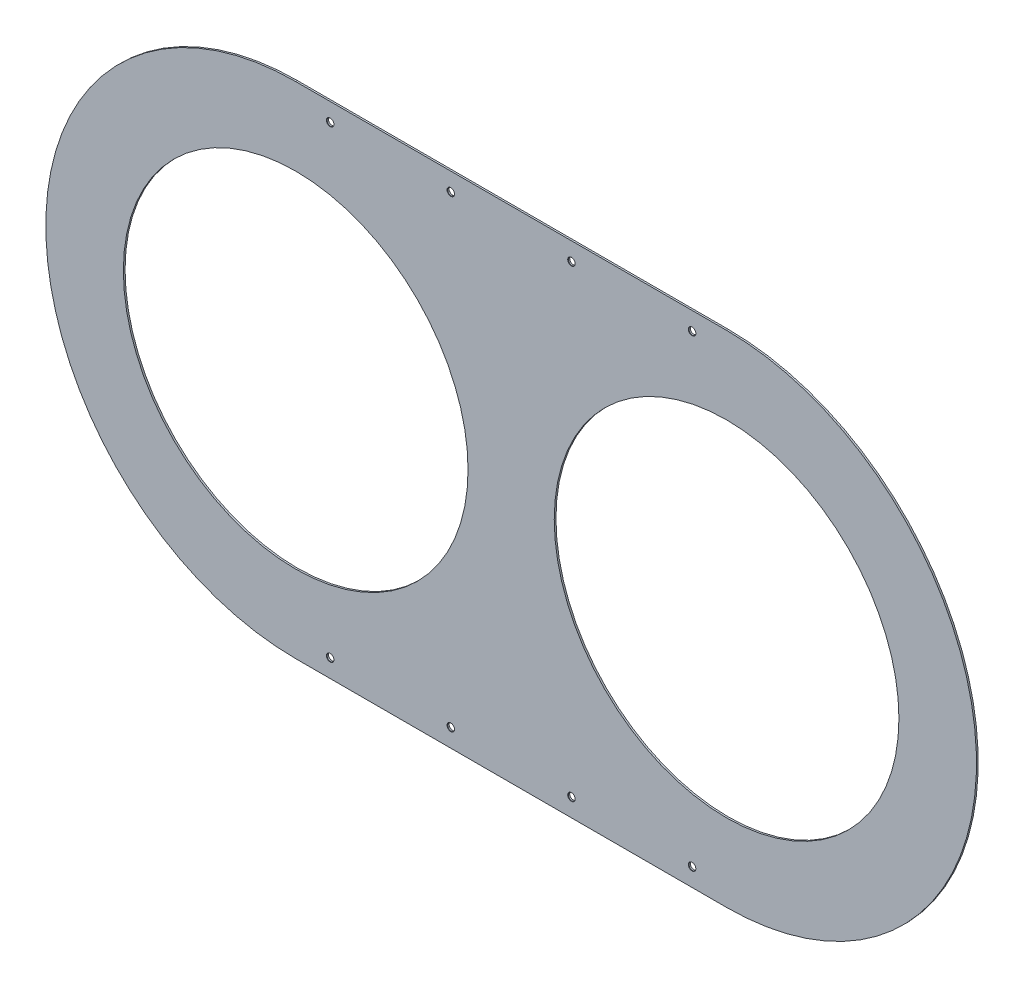
ISO-10303-21;
HEADER;
FILE_DESCRIPTION(('STEP AP214'),'2;1');
FILE_NAME('part.step','',(''),(''),'','','');
FILE_SCHEMA(('AUTOMOTIVE_DESIGN { 1 0 10303 214 1 1 1 1 }'));
ENDSEC;
DATA;
#1=APPLICATION_CONTEXT('core data for automotive mechanical design processes');
#2=APPLICATION_PROTOCOL_DEFINITION('international standard','automotive_design',2000,#1);
#3=PRODUCT_CONTEXT('',#1,'mechanical');
#4=PRODUCT('Part','Part','',(#3));
#5=PRODUCT_RELATED_PRODUCT_CATEGORY('part','',(#4));
#6=PRODUCT_DEFINITION_FORMATION('','',#4);
#7=PRODUCT_DEFINITION_CONTEXT('part definition',#1,'design');
#8=PRODUCT_DEFINITION('design','',#6,#7);
#9=PRODUCT_DEFINITION_SHAPE('','',#8);
#10=(LENGTH_UNIT() NAMED_UNIT(*) SI_UNIT(.MILLI.,.METRE.));
#11=(NAMED_UNIT(*) PLANE_ANGLE_UNIT() SI_UNIT($,.RADIAN.));
#12=(NAMED_UNIT(*) SI_UNIT($,.STERADIAN.) SOLID_ANGLE_UNIT());
#13=UNCERTAINTY_MEASURE_WITH_UNIT(LENGTH_MEASURE(1.E-05),#10,'distance_accuracy_value','');
#14=(GEOMETRIC_REPRESENTATION_CONTEXT(3) GLOBAL_UNCERTAINTY_ASSIGNED_CONTEXT((#13)) GLOBAL_UNIT_ASSIGNED_CONTEXT((#10,
#11,#12)) REPRESENTATION_CONTEXT('',''));
#15=CARTESIAN_POINT('',(0.,0.,0.));
#16=DIRECTION('',(0.,0.,1.));
#17=DIRECTION('',(1.,0.,0.));
#18=AXIS2_PLACEMENT_3D('',#15,#16,#17);
#19=CARTESIAN_POINT('',(-125.,0.,-1.));
#20=DIRECTION('',(0.,0.,1.));
#21=DIRECTION('',(1.,0.,0.));
#22=AXIS2_PLACEMENT_3D('',#19,#20,#21);
#23=CYLINDRICAL_SURFACE('',#22,145.);
#24=CARTESIAN_POINT('',(-125.,0.,0.));
#25=DIRECTION('',(0.,0.,1.));
#26=DIRECTION('',(1.,0.,0.));
#27=AXIS2_PLACEMENT_3D('',#24,#25,#26);
#28=CIRCLE('',#27,145.);
#29=CARTESIAN_POINT('',(-125.,145.,0.));
#30=VERTEX_POINT('',#29);
#31=CARTESIAN_POINT('',(-125.,-145.,0.));
#32=VERTEX_POINT('',#31);
#33=EDGE_CURVE('E103',#30,#32,#28,.T.);
#34=ORIENTED_EDGE('',*,*,#33,.F.);
#35=DIRECTION('',(0.,0.,1.));
#36=VECTOR('',#35,1.);
#37=CARTESIAN_POINT('',(-125.,145.,-1.));
#38=LINE('',#37,#36);
#39=CARTESIAN_POINT('',(-125.,145.,-1.));
#40=VERTEX_POINT('',#39);
#41=EDGE_CURVE('E11',#40,#30,#38,.T.);
#42=ORIENTED_EDGE('',*,*,#41,.F.);
#43=CARTESIAN_POINT('',(-125.,0.,-1.));
#44=DIRECTION('',(0.,0.,1.));
#45=DIRECTION('',(1.,0.,0.));
#46=AXIS2_PLACEMENT_3D('',#43,#44,#45);
#47=CIRCLE('',#46,145.);
#48=CARTESIAN_POINT('',(-125.,-145.,-1.));
#49=VERTEX_POINT('',#48);
#50=EDGE_CURVE('E96',#40,#49,#47,.T.);
#51=ORIENTED_EDGE('',*,*,#50,.T.);
#52=DIRECTION('',(0.,0.,1.));
#53=VECTOR('',#52,1.);
#54=CARTESIAN_POINT('',(-125.,-145.,-1.));
#55=LINE('',#54,#53);
#56=EDGE_CURVE('E79',#49,#32,#55,.T.);
#57=ORIENTED_EDGE('',*,*,#56,.T.);
#58=EDGE_LOOP('',(#34,#42,#51,#57));
#59=FACE_BOUND('',#58,.T.);
#60=ADVANCED_FACE('F36',(#59),#23,.T.);
#61=CARTESIAN_POINT('',(-125.,145.,-1.));
#62=DIRECTION('',(0.,1.,0.));
#63=DIRECTION('',(0.,0.,1.));
#64=AXIS2_PLACEMENT_3D('',#61,#62,#63);
#65=PLANE('',#64);
#66=DIRECTION('',(-1.,0.,0.));
#67=VECTOR('',#66,1.);
#68=CARTESIAN_POINT('',(-125.,145.,0.));
#69=LINE('',#68,#67);
#70=CARTESIAN_POINT('',(125.,145.,0.));
#71=VERTEX_POINT('',#70);
#72=EDGE_CURVE('E98',#71,#30,#69,.T.);
#73=ORIENTED_EDGE('',*,*,#72,.F.);
#74=DIRECTION('',(0.,0.,1.));
#75=VECTOR('',#74,1.);
#76=CARTESIAN_POINT('',(125.,145.,-1.));
#77=LINE('',#76,#75);
#78=CARTESIAN_POINT('',(125.,145.,-1.));
#79=VERTEX_POINT('',#78);
#80=EDGE_CURVE('E45',#79,#71,#77,.T.);
#81=ORIENTED_EDGE('',*,*,#80,.F.);
#82=DIRECTION('',(-1.,0.,0.));
#83=VECTOR('',#82,1.);
#84=CARTESIAN_POINT('',(-125.,145.,-1.));
#85=LINE('',#84,#83);
#86=EDGE_CURVE('E93',#79,#40,#85,.T.);
#87=ORIENTED_EDGE('',*,*,#86,.T.);
#88=ORIENTED_EDGE('',*,*,#41,.T.);
#89=EDGE_LOOP('',(#73,#81,#87,#88));
#90=FACE_BOUND('',#89,.T.);
#91=ADVANCED_FACE('F199',(#90),#65,.T.);
#92=CARTESIAN_POINT('',(125.,0.,-1.));
#93=DIRECTION('',(0.,0.,1.));
#94=DIRECTION('',(1.,0.,0.));
#95=AXIS2_PLACEMENT_3D('',#92,#93,#94);
#96=CYLINDRICAL_SURFACE('',#95,145.);
#97=CARTESIAN_POINT('',(125.,0.,0.));
#98=DIRECTION('',(0.,0.,1.));
#99=DIRECTION('',(1.,0.,0.));
#100=AXIS2_PLACEMENT_3D('',#97,#98,#99);
#101=CIRCLE('',#100,145.);
#102=CARTESIAN_POINT('',(125.,-145.,0.));
#103=VERTEX_POINT('',#102);
#104=EDGE_CURVE('E87',#103,#71,#101,.T.);
#105=ORIENTED_EDGE('',*,*,#104,.F.);
#106=DIRECTION('',(0.,0.,1.));
#107=VECTOR('',#106,1.);
#108=CARTESIAN_POINT('',(125.,-145.,-1.));
#109=LINE('',#108,#107);
#110=CARTESIAN_POINT('',(125.,-145.,-1.));
#111=VERTEX_POINT('',#110);
#112=EDGE_CURVE('E82',#111,#103,#109,.T.);
#113=ORIENTED_EDGE('',*,*,#112,.F.);
#114=CARTESIAN_POINT('',(125.,0.,-1.));
#115=DIRECTION('',(0.,0.,1.));
#116=DIRECTION('',(1.,0.,0.));
#117=AXIS2_PLACEMENT_3D('',#114,#115,#116);
#118=CIRCLE('',#117,145.);
#119=EDGE_CURVE('E85',#111,#79,#118,.T.);
#120=ORIENTED_EDGE('',*,*,#119,.T.);
#121=ORIENTED_EDGE('',*,*,#80,.T.);
#122=EDGE_LOOP('',(#105,#113,#120,#121));
#123=FACE_BOUND('',#122,.T.);
#124=ADVANCED_FACE('F84',(#123),#96,.T.);
#125=CARTESIAN_POINT('',(-125.,-145.,-1.));
#126=DIRECTION('',(0.,-1.,0.));
#127=DIRECTION('',(0.,0.,-1.));
#128=AXIS2_PLACEMENT_3D('',#125,#126,#127);
#129=PLANE('',#128);
#130=DIRECTION('',(1.,0.,0.));
#131=VECTOR('',#130,1.);
#132=CARTESIAN_POINT('',(-125.,-145.,0.));
#133=LINE('',#132,#131);
#134=EDGE_CURVE('E106',#32,#103,#133,.T.);
#135=ORIENTED_EDGE('',*,*,#134,.F.);
#136=ORIENTED_EDGE('',*,*,#56,.F.);
#137=DIRECTION('',(1.,0.,0.));
#138=VECTOR('',#137,1.);
#139=CARTESIAN_POINT('',(-125.,-145.,-1.));
#140=LINE('',#139,#138);
#141=EDGE_CURVE('E92',#49,#111,#140,.T.);
#142=ORIENTED_EDGE('',*,*,#141,.T.);
#143=ORIENTED_EDGE('',*,*,#112,.T.);
#144=EDGE_LOOP('',(#135,#136,#142,#143));
#145=FACE_BOUND('',#144,.T.);
#146=ADVANCED_FACE('F95',(#145),#129,.T.);
#147=CARTESIAN_POINT('',(-125.,0.,-1.));
#148=DIRECTION('',(0.,0.,1.));
#149=DIRECTION('',(1.,0.,0.));
#150=AXIS2_PLACEMENT_3D('',#147,#148,#149);
#151=PLANE('',#150);
#152=CARTESIAN_POINT('',(-105.,134.5,-1.));
#153=DIRECTION('',(0.,0.,1.));
#154=DIRECTION('',(1.,0.,0.));
#155=AXIS2_PLACEMENT_3D('',#152,#153,#154);
#156=CIRCLE('',#155,2.);
#157=CARTESIAN_POINT('',(-103.,134.5,-1.));
#158=VERTEX_POINT('',#157);
#159=EDGE_CURVE('E39',#158,#158,#156,.T.);
#160=ORIENTED_EDGE('',*,*,#159,.T.);
#161=EDGE_LOOP('',(#160));
#162=FACE_BOUND('',#161,.T.);
#163=CARTESIAN_POINT('',(35.,134.5,-1.));
#164=DIRECTION('',(0.,0.,1.));
#165=DIRECTION('',(1.,0.,0.));
#166=AXIS2_PLACEMENT_3D('',#163,#164,#165);
#167=CIRCLE('',#166,2.);
#168=CARTESIAN_POINT('',(37.,134.5,-1.));
#169=VERTEX_POINT('',#168);
#170=EDGE_CURVE('E143',#169,#169,#167,.T.);
#171=ORIENTED_EDGE('',*,*,#170,.T.);
#172=EDGE_LOOP('',(#171));
#173=FACE_BOUND('',#172,.T.);
#174=CARTESIAN_POINT('',(-35.,134.5,-1.));
#175=DIRECTION('',(0.,0.,1.));
#176=DIRECTION('',(1.,0.,0.));
#177=AXIS2_PLACEMENT_3D('',#174,#175,#176);
#178=CIRCLE('',#177,2.);
#179=CARTESIAN_POINT('',(-33.,134.5,-1.));
#180=VERTEX_POINT('',#179);
#181=EDGE_CURVE('E139',#180,#180,#178,.T.);
#182=ORIENTED_EDGE('',*,*,#181,.T.);
#183=EDGE_LOOP('',(#182));
#184=FACE_BOUND('',#183,.T.);
#185=CARTESIAN_POINT('',(105.,134.5,-1.));
#186=DIRECTION('',(0.,0.,1.));
#187=DIRECTION('',(1.,0.,0.));
#188=AXIS2_PLACEMENT_3D('',#185,#186,#187);
#189=CIRCLE('',#188,2.);
#190=CARTESIAN_POINT('',(107.,134.5,-1.));
#191=VERTEX_POINT('',#190);
#192=EDGE_CURVE('E134',#191,#191,#189,.T.);
#193=ORIENTED_EDGE('',*,*,#192,.T.);
#194=EDGE_LOOP('',(#193));
#195=FACE_BOUND('',#194,.T.);
#196=CARTESIAN_POINT('',(105.,-134.5,-1.));
#197=DIRECTION('',(0.,0.,1.));
#198=DIRECTION('',(1.,0.,0.));
#199=AXIS2_PLACEMENT_3D('',#196,#197,#198);
#200=CIRCLE('',#199,2.);
#201=CARTESIAN_POINT('',(107.,-134.5,-1.));
#202=VERTEX_POINT('',#201);
#203=EDGE_CURVE('E129',#202,#202,#200,.T.);
#204=ORIENTED_EDGE('',*,*,#203,.T.);
#205=EDGE_LOOP('',(#204));
#206=FACE_BOUND('',#205,.T.);
#207=CARTESIAN_POINT('',(35.,-134.5,-1.));
#208=DIRECTION('',(0.,0.,1.));
#209=DIRECTION('',(1.,0.,0.));
#210=AXIS2_PLACEMENT_3D('',#207,#208,#209);
#211=CIRCLE('',#210,2.);
#212=CARTESIAN_POINT('',(37.,-134.5,-1.));
#213=VERTEX_POINT('',#212);
#214=EDGE_CURVE('E124',#213,#213,#211,.T.);
#215=ORIENTED_EDGE('',*,*,#214,.T.);
#216=EDGE_LOOP('',(#215));
#217=FACE_BOUND('',#216,.T.);
#218=CARTESIAN_POINT('',(-35.,-134.5,-1.));
#219=DIRECTION('',(0.,0.,1.));
#220=DIRECTION('',(1.,0.,0.));
#221=AXIS2_PLACEMENT_3D('',#218,#219,#220);
#222=CIRCLE('',#221,2.);
#223=CARTESIAN_POINT('',(-33.,-134.5,-1.));
#224=VERTEX_POINT('',#223);
#225=EDGE_CURVE('E119',#224,#224,#222,.T.);
#226=ORIENTED_EDGE('',*,*,#225,.T.);
#227=EDGE_LOOP('',(#226));
#228=FACE_BOUND('',#227,.T.);
#229=CARTESIAN_POINT('',(-105.,-134.5,-1.));
#230=DIRECTION('',(0.,0.,1.));
#231=DIRECTION('',(1.,0.,0.));
#232=AXIS2_PLACEMENT_3D('',#229,#230,#231);
#233=CIRCLE('',#232,2.);
#234=CARTESIAN_POINT('',(-103.,-134.5,-1.));
#235=VERTEX_POINT('',#234);
#236=EDGE_CURVE('E114',#235,#235,#233,.T.);
#237=ORIENTED_EDGE('',*,*,#236,.T.);
#238=EDGE_LOOP('',(#237));
#239=FACE_BOUND('',#238,.T.);
#240=CARTESIAN_POINT('',(125.,0.,-1.));
#241=DIRECTION('',(0.,0.,1.));
#242=DIRECTION('',(1.,0.,0.));
#243=AXIS2_PLACEMENT_3D('',#240,#241,#242);
#244=CIRCLE('',#243,100.);
#245=CARTESIAN_POINT('',(225.,0.,-1.));
#246=VERTEX_POINT('',#245);
#247=EDGE_CURVE('E182',#246,#246,#244,.T.);
#248=ORIENTED_EDGE('',*,*,#247,.T.);
#249=EDGE_LOOP('',(#248));
#250=FACE_BOUND('',#249,.T.);
#251=CARTESIAN_POINT('',(-125.,0.,-1.));
#252=DIRECTION('',(0.,0.,1.));
#253=DIRECTION('',(1.,0.,0.));
#254=AXIS2_PLACEMENT_3D('',#251,#252,#253);
#255=CIRCLE('',#254,100.);
#256=CARTESIAN_POINT('',(-25.,0.,-1.));
#257=VERTEX_POINT('',#256);
#258=EDGE_CURVE('E107',#257,#257,#255,.T.);
#259=ORIENTED_EDGE('',*,*,#258,.T.);
#260=EDGE_LOOP('',(#259));
#261=FACE_BOUND('',#260,.T.);
#262=ORIENTED_EDGE('',*,*,#50,.F.);
#263=ORIENTED_EDGE('',*,*,#86,.F.);
#264=ORIENTED_EDGE('',*,*,#119,.F.);
#265=ORIENTED_EDGE('',*,*,#141,.F.);
#266=EDGE_LOOP('',(#262,#263,#264,#265));
#267=FACE_BOUND('',#266,.T.);
#268=ADVANCED_FACE('F91',(#162,#173,#184,#195,#206,#217,#228,#239,#250,#261,#267),#151,.F.);
#269=CARTESIAN_POINT('',(-125.,0.,0.));
#270=DIRECTION('',(0.,0.,1.));
#271=DIRECTION('',(1.,0.,0.));
#272=AXIS2_PLACEMENT_3D('',#269,#270,#271);
#273=PLANE('',#272);
#274=CARTESIAN_POINT('',(-105.,134.5,0.));
#275=DIRECTION('',(0.,0.,1.));
#276=DIRECTION('',(1.,0.,0.));
#277=AXIS2_PLACEMENT_3D('',#274,#275,#276);
#278=CIRCLE('',#277,2.175);
#279=CARTESIAN_POINT('',(-102.825,134.5,0.));
#280=VERTEX_POINT('',#279);
#281=EDGE_CURVE('E294',#280,#280,#278,.T.);
#282=ORIENTED_EDGE('',*,*,#281,.F.);
#283=EDGE_LOOP('',(#282));
#284=FACE_BOUND('',#283,.T.);
#285=CARTESIAN_POINT('',(35.,134.5,0.));
#286=DIRECTION('',(0.,0.,1.));
#287=DIRECTION('',(1.,0.,0.));
#288=AXIS2_PLACEMENT_3D('',#285,#286,#287);
#289=CIRCLE('',#288,2.175);
#290=CARTESIAN_POINT('',(37.175,134.5,0.));
#291=VERTEX_POINT('',#290);
#292=EDGE_CURVE('E152',#291,#291,#289,.T.);
#293=ORIENTED_EDGE('',*,*,#292,.F.);
#294=EDGE_LOOP('',(#293));
#295=FACE_BOUND('',#294,.T.);
#296=CARTESIAN_POINT('',(-35.,134.5,0.));
#297=DIRECTION('',(0.,0.,1.));
#298=DIRECTION('',(1.,0.,0.));
#299=AXIS2_PLACEMENT_3D('',#296,#297,#298);
#300=CIRCLE('',#299,2.175);
#301=CARTESIAN_POINT('',(-32.825,134.5,0.));
#302=VERTEX_POINT('',#301);
#303=EDGE_CURVE('E145',#302,#302,#300,.T.);
#304=ORIENTED_EDGE('',*,*,#303,.F.);
#305=EDGE_LOOP('',(#304));
#306=FACE_BOUND('',#305,.T.);
#307=CARTESIAN_POINT('',(105.,134.5,0.));
#308=DIRECTION('',(0.,0.,1.));
#309=DIRECTION('',(1.,0.,0.));
#310=AXIS2_PLACEMENT_3D('',#307,#308,#309);
#311=CIRCLE('',#310,2.175);
#312=CARTESIAN_POINT('',(107.175,134.5,0.));
#313=VERTEX_POINT('',#312);
#314=EDGE_CURVE('E141',#313,#313,#311,.T.);
#315=ORIENTED_EDGE('',*,*,#314,.F.);
#316=EDGE_LOOP('',(#315));
#317=FACE_BOUND('',#316,.T.);
#318=CARTESIAN_POINT('',(105.,-134.5,0.));
#319=DIRECTION('',(0.,0.,1.));
#320=DIRECTION('',(1.,0.,0.));
#321=AXIS2_PLACEMENT_3D('',#318,#319,#320);
#322=CIRCLE('',#321,2.175);
#323=CARTESIAN_POINT('',(107.175,-134.5,0.));
#324=VERTEX_POINT('',#323);
#325=EDGE_CURVE('E137',#324,#324,#322,.T.);
#326=ORIENTED_EDGE('',*,*,#325,.F.);
#327=EDGE_LOOP('',(#326));
#328=FACE_BOUND('',#327,.T.);
#329=CARTESIAN_POINT('',(35.,-134.5,0.));
#330=DIRECTION('',(0.,0.,1.));
#331=DIRECTION('',(1.,0.,0.));
#332=AXIS2_PLACEMENT_3D('',#329,#330,#331);
#333=CIRCLE('',#332,2.175);
#334=CARTESIAN_POINT('',(37.175,-134.5,0.));
#335=VERTEX_POINT('',#334);
#336=EDGE_CURVE('E132',#335,#335,#333,.T.);
#337=ORIENTED_EDGE('',*,*,#336,.F.);
#338=EDGE_LOOP('',(#337));
#339=FACE_BOUND('',#338,.T.);
#340=CARTESIAN_POINT('',(-35.,-134.5,0.));
#341=DIRECTION('',(0.,0.,1.));
#342=DIRECTION('',(1.,0.,0.));
#343=AXIS2_PLACEMENT_3D('',#340,#341,#342);
#344=CIRCLE('',#343,2.175);
#345=CARTESIAN_POINT('',(-32.825,-134.5,0.));
#346=VERTEX_POINT('',#345);
#347=EDGE_CURVE('E127',#346,#346,#344,.T.);
#348=ORIENTED_EDGE('',*,*,#347,.F.);
#349=EDGE_LOOP('',(#348));
#350=FACE_BOUND('',#349,.T.);
#351=CARTESIAN_POINT('',(-105.,-134.5,0.));
#352=DIRECTION('',(0.,0.,1.));
#353=DIRECTION('',(1.,0.,0.));
#354=AXIS2_PLACEMENT_3D('',#351,#352,#353);
#355=CIRCLE('',#354,2.175);
#356=CARTESIAN_POINT('',(-102.825,-134.5,0.));
#357=VERTEX_POINT('',#356);
#358=EDGE_CURVE('E122',#357,#357,#355,.T.);
#359=ORIENTED_EDGE('',*,*,#358,.F.);
#360=EDGE_LOOP('',(#359));
#361=FACE_BOUND('',#360,.T.);
#362=CARTESIAN_POINT('',(125.,0.,0.));
#363=DIRECTION('',(0.,0.,1.));
#364=DIRECTION('',(1.,0.,0.));
#365=AXIS2_PLACEMENT_3D('',#362,#363,#364);
#366=CIRCLE('',#365,100.);
#367=CARTESIAN_POINT('',(225.,0.,0.));
#368=VERTEX_POINT('',#367);
#369=EDGE_CURVE('E117',#368,#368,#366,.T.);
#370=ORIENTED_EDGE('',*,*,#369,.F.);
#371=EDGE_LOOP('',(#370));
#372=FACE_BOUND('',#371,.T.);
#373=CARTESIAN_POINT('',(-125.,0.,0.));
#374=DIRECTION('',(0.,0.,1.));
#375=DIRECTION('',(1.,0.,0.));
#376=AXIS2_PLACEMENT_3D('',#373,#374,#375);
#377=CIRCLE('',#376,100.);
#378=CARTESIAN_POINT('',(-25.,0.,0.));
#379=VERTEX_POINT('',#378);
#380=EDGE_CURVE('E185',#379,#379,#377,.T.);
#381=ORIENTED_EDGE('',*,*,#380,.F.);
#382=EDGE_LOOP('',(#381));
#383=FACE_BOUND('',#382,.T.);
#384=ORIENTED_EDGE('',*,*,#33,.T.);
#385=ORIENTED_EDGE('',*,*,#134,.T.);
#386=ORIENTED_EDGE('',*,*,#104,.T.);
#387=ORIENTED_EDGE('',*,*,#72,.T.);
#388=EDGE_LOOP('',(#384,#385,#386,#387));
#389=FACE_BOUND('',#388,.T.);
#390=ADVANCED_FACE('F194',(#284,#295,#306,#317,#328,#339,#350,#361,#372,#383,#389),#273,.T.);
#391=CARTESIAN_POINT('',(-125.,0.,-1.));
#392=DIRECTION('',(0.,0.,1.));
#393=DIRECTION('',(1.,0.,0.));
#394=AXIS2_PLACEMENT_3D('',#391,#392,#393);
#395=CYLINDRICAL_SURFACE('',#394,100.);
#396=ORIENTED_EDGE('',*,*,#258,.F.);
#397=EDGE_LOOP('',(#396));
#398=FACE_BOUND('',#397,.T.);
#399=ORIENTED_EDGE('',*,*,#380,.T.);
#400=EDGE_LOOP('',(#399));
#401=FACE_BOUND('',#400,.T.);
#402=ADVANCED_FACE('F192',(#398,#401),#395,.F.);
#403=CARTESIAN_POINT('',(125.,0.,-1.));
#404=DIRECTION('',(0.,0.,1.));
#405=DIRECTION('',(1.,0.,0.));
#406=AXIS2_PLACEMENT_3D('',#403,#404,#405);
#407=CYLINDRICAL_SURFACE('',#406,100.);
#408=ORIENTED_EDGE('',*,*,#247,.F.);
#409=EDGE_LOOP('',(#408));
#410=FACE_BOUND('',#409,.T.);
#411=ORIENTED_EDGE('',*,*,#369,.T.);
#412=EDGE_LOOP('',(#411));
#413=FACE_BOUND('',#412,.T.);
#414=ADVANCED_FACE('F219',(#410,#413),#407,.F.);
#415=CARTESIAN_POINT('',(-105.,-134.5,0.));
#416=DIRECTION('',(0.,0.,1.));
#417=DIRECTION('',(1.,0.,0.));
#418=AXIS2_PLACEMENT_3D('',#415,#416,#417);
#419=CYLINDRICAL_SURFACE('',#418,2.);
#420=CARTESIAN_POINT('',(-105.,-134.5,-0.174999999999999));
#421=DIRECTION('',(0.,0.,1.));
#422=DIRECTION('',(1.,0.,0.));
#423=AXIS2_PLACEMENT_3D('',#420,#421,#422);
#424=CIRCLE('',#423,2.);
#425=CARTESIAN_POINT('',(-103.,-134.5,-0.174999999999999));
#426=VERTEX_POINT('',#425);
#427=EDGE_CURVE('E118',#426,#426,#424,.T.);
#428=ORIENTED_EDGE('',*,*,#427,.T.);
#429=EDGE_LOOP('',(#428));
#430=FACE_BOUND('',#429,.T.);
#431=ORIENTED_EDGE('',*,*,#236,.F.);
#432=EDGE_LOOP('',(#431));
#433=FACE_BOUND('',#432,.T.);
#434=ADVANCED_FACE('F223',(#430,#433),#419,.F.);
#435=CARTESIAN_POINT('',(-105.,-134.5,0.));
#436=DIRECTION('',(0.,0.,1.));
#437=DIRECTION('',(1.,0.,0.));
#438=AXIS2_PLACEMENT_3D('',#435,#436,#437);
#439=CONICAL_SURFACE('',#438,2.175,0.785398163397435);
#440=ORIENTED_EDGE('',*,*,#427,.F.);
#441=EDGE_LOOP('',(#440));
#442=FACE_BOUND('',#441,.T.);
#443=ORIENTED_EDGE('',*,*,#358,.T.);
#444=EDGE_LOOP('',(#443));
#445=FACE_BOUND('',#444,.T.);
#446=ADVANCED_FACE('F227',(#442,#445),#439,.F.);
#447=CARTESIAN_POINT('',(-35.,-134.5,0.));
#448=DIRECTION('',(0.,0.,1.));
#449=DIRECTION('',(1.,0.,0.));
#450=AXIS2_PLACEMENT_3D('',#447,#448,#449);
#451=CYLINDRICAL_SURFACE('',#450,2.);
#452=CARTESIAN_POINT('',(-35.,-134.5,-0.174999999999999));
#453=DIRECTION('',(0.,0.,1.));
#454=DIRECTION('',(1.,0.,0.));
#455=AXIS2_PLACEMENT_3D('',#452,#453,#454);
#456=CIRCLE('',#455,2.);
#457=CARTESIAN_POINT('',(-33.,-134.5,-0.174999999999999));
#458=VERTEX_POINT('',#457);
#459=EDGE_CURVE('E123',#458,#458,#456,.T.);
#460=ORIENTED_EDGE('',*,*,#459,.T.);
#461=EDGE_LOOP('',(#460));
#462=FACE_BOUND('',#461,.T.);
#463=ORIENTED_EDGE('',*,*,#225,.F.);
#464=EDGE_LOOP('',(#463));
#465=FACE_BOUND('',#464,.T.);
#466=ADVANCED_FACE('F231',(#462,#465),#451,.F.);
#467=CARTESIAN_POINT('',(-35.,-134.5,0.));
#468=DIRECTION('',(0.,0.,1.));
#469=DIRECTION('',(1.,0.,0.));
#470=AXIS2_PLACEMENT_3D('',#467,#468,#469);
#471=CONICAL_SURFACE('',#470,2.175,0.785398163397435);
#472=ORIENTED_EDGE('',*,*,#459,.F.);
#473=EDGE_LOOP('',(#472));
#474=FACE_BOUND('',#473,.T.);
#475=ORIENTED_EDGE('',*,*,#347,.T.);
#476=EDGE_LOOP('',(#475));
#477=FACE_BOUND('',#476,.T.);
#478=ADVANCED_FACE('F235',(#474,#477),#471,.F.);
#479=CARTESIAN_POINT('',(35.,-134.5,0.));
#480=DIRECTION('',(0.,0.,1.));
#481=DIRECTION('',(1.,0.,0.));
#482=AXIS2_PLACEMENT_3D('',#479,#480,#481);
#483=CYLINDRICAL_SURFACE('',#482,2.);
#484=CARTESIAN_POINT('',(35.,-134.5,-0.174999999999999));
#485=DIRECTION('',(0.,0.,1.));
#486=DIRECTION('',(1.,0.,0.));
#487=AXIS2_PLACEMENT_3D('',#484,#485,#486);
#488=CIRCLE('',#487,2.);
#489=CARTESIAN_POINT('',(37.,-134.5,-0.174999999999999));
#490=VERTEX_POINT('',#489);
#491=EDGE_CURVE('E128',#490,#490,#488,.T.);
#492=ORIENTED_EDGE('',*,*,#491,.T.);
#493=EDGE_LOOP('',(#492));
#494=FACE_BOUND('',#493,.T.);
#495=ORIENTED_EDGE('',*,*,#214,.F.);
#496=EDGE_LOOP('',(#495));
#497=FACE_BOUND('',#496,.T.);
#498=ADVANCED_FACE('F239',(#494,#497),#483,.F.);
#499=CARTESIAN_POINT('',(35.,-134.5,0.));
#500=DIRECTION('',(0.,0.,1.));
#501=DIRECTION('',(1.,0.,0.));
#502=AXIS2_PLACEMENT_3D('',#499,#500,#501);
#503=CONICAL_SURFACE('',#502,2.175,0.785398163397435);
#504=ORIENTED_EDGE('',*,*,#491,.F.);
#505=EDGE_LOOP('',(#504));
#506=FACE_BOUND('',#505,.T.);
#507=ORIENTED_EDGE('',*,*,#336,.T.);
#508=EDGE_LOOP('',(#507));
#509=FACE_BOUND('',#508,.T.);
#510=ADVANCED_FACE('F243',(#506,#509),#503,.F.);
#511=CARTESIAN_POINT('',(105.,-134.5,0.));
#512=DIRECTION('',(0.,0.,1.));
#513=DIRECTION('',(1.,0.,0.));
#514=AXIS2_PLACEMENT_3D('',#511,#512,#513);
#515=CYLINDRICAL_SURFACE('',#514,2.);
#516=CARTESIAN_POINT('',(105.,-134.5,-0.174999999999999));
#517=DIRECTION('',(0.,0.,1.));
#518=DIRECTION('',(1.,0.,0.));
#519=AXIS2_PLACEMENT_3D('',#516,#517,#518);
#520=CIRCLE('',#519,2.);
#521=CARTESIAN_POINT('',(107.,-134.5,-0.174999999999999));
#522=VERTEX_POINT('',#521);
#523=EDGE_CURVE('E133',#522,#522,#520,.T.);
#524=ORIENTED_EDGE('',*,*,#523,.T.);
#525=EDGE_LOOP('',(#524));
#526=FACE_BOUND('',#525,.T.);
#527=ORIENTED_EDGE('',*,*,#203,.F.);
#528=EDGE_LOOP('',(#527));
#529=FACE_BOUND('',#528,.T.);
#530=ADVANCED_FACE('F247',(#526,#529),#515,.F.);
#531=CARTESIAN_POINT('',(105.,-134.5,0.));
#532=DIRECTION('',(0.,0.,1.));
#533=DIRECTION('',(1.,0.,0.));
#534=AXIS2_PLACEMENT_3D('',#531,#532,#533);
#535=CONICAL_SURFACE('',#534,2.175,0.785398163397435);
#536=ORIENTED_EDGE('',*,*,#523,.F.);
#537=EDGE_LOOP('',(#536));
#538=FACE_BOUND('',#537,.T.);
#539=ORIENTED_EDGE('',*,*,#325,.T.);
#540=EDGE_LOOP('',(#539));
#541=FACE_BOUND('',#540,.T.);
#542=ADVANCED_FACE('F251',(#538,#541),#535,.F.);
#543=CARTESIAN_POINT('',(105.,134.5,0.));
#544=DIRECTION('',(0.,0.,1.));
#545=DIRECTION('',(1.,0.,0.));
#546=AXIS2_PLACEMENT_3D('',#543,#544,#545);
#547=CYLINDRICAL_SURFACE('',#546,2.);
#548=CARTESIAN_POINT('',(105.,134.5,-0.174999999999999));
#549=DIRECTION('',(0.,0.,1.));
#550=DIRECTION('',(1.,0.,0.));
#551=AXIS2_PLACEMENT_3D('',#548,#549,#550);
#552=CIRCLE('',#551,2.);
#553=CARTESIAN_POINT('',(107.,134.5,-0.174999999999999));
#554=VERTEX_POINT('',#553);
#555=EDGE_CURVE('E138',#554,#554,#552,.T.);
#556=ORIENTED_EDGE('',*,*,#555,.T.);
#557=EDGE_LOOP('',(#556));
#558=FACE_BOUND('',#557,.T.);
#559=ORIENTED_EDGE('',*,*,#192,.F.);
#560=EDGE_LOOP('',(#559));
#561=FACE_BOUND('',#560,.T.);
#562=ADVANCED_FACE('F255',(#558,#561),#547,.F.);
#563=CARTESIAN_POINT('',(105.,134.5,0.));
#564=DIRECTION('',(0.,0.,1.));
#565=DIRECTION('',(1.,0.,0.));
#566=AXIS2_PLACEMENT_3D('',#563,#564,#565);
#567=CONICAL_SURFACE('',#566,2.175,0.785398163397435);
#568=ORIENTED_EDGE('',*,*,#555,.F.);
#569=EDGE_LOOP('',(#568));
#570=FACE_BOUND('',#569,.T.);
#571=ORIENTED_EDGE('',*,*,#314,.T.);
#572=EDGE_LOOP('',(#571));
#573=FACE_BOUND('',#572,.T.);
#574=ADVANCED_FACE('F259',(#570,#573),#567,.F.);
#575=CARTESIAN_POINT('',(-35.,134.5,0.));
#576=DIRECTION('',(0.,0.,1.));
#577=DIRECTION('',(1.,0.,0.));
#578=AXIS2_PLACEMENT_3D('',#575,#576,#577);
#579=CYLINDRICAL_SURFACE('',#578,2.);
#580=CARTESIAN_POINT('',(-35.,134.5,-0.174999999999999));
#581=DIRECTION('',(0.,0.,1.));
#582=DIRECTION('',(1.,0.,0.));
#583=AXIS2_PLACEMENT_3D('',#580,#581,#582);
#584=CIRCLE('',#583,2.);
#585=CARTESIAN_POINT('',(-33.,134.5,-0.174999999999999));
#586=VERTEX_POINT('',#585);
#587=EDGE_CURVE('E142',#586,#586,#584,.T.);
#588=ORIENTED_EDGE('',*,*,#587,.T.);
#589=EDGE_LOOP('',(#588));
#590=FACE_BOUND('',#589,.T.);
#591=ORIENTED_EDGE('',*,*,#181,.F.);
#592=EDGE_LOOP('',(#591));
#593=FACE_BOUND('',#592,.T.);
#594=ADVANCED_FACE('F263',(#590,#593),#579,.F.);
#595=CARTESIAN_POINT('',(-35.,134.5,0.));
#596=DIRECTION('',(0.,0.,1.));
#597=DIRECTION('',(1.,0.,0.));
#598=AXIS2_PLACEMENT_3D('',#595,#596,#597);
#599=CONICAL_SURFACE('',#598,2.175,0.785398163397435);
#600=ORIENTED_EDGE('',*,*,#587,.F.);
#601=EDGE_LOOP('',(#600));
#602=FACE_BOUND('',#601,.T.);
#603=ORIENTED_EDGE('',*,*,#303,.T.);
#604=EDGE_LOOP('',(#603));
#605=FACE_BOUND('',#604,.T.);
#606=ADVANCED_FACE('F267',(#602,#605),#599,.F.);
#607=CARTESIAN_POINT('',(35.,134.5,0.));
#608=DIRECTION('',(0.,0.,1.));
#609=DIRECTION('',(1.,0.,0.));
#610=AXIS2_PLACEMENT_3D('',#607,#608,#609);
#611=CYLINDRICAL_SURFACE('',#610,2.);
#612=CARTESIAN_POINT('',(35.,134.5,-0.174999999999999));
#613=DIRECTION('',(0.,0.,1.));
#614=DIRECTION('',(1.,0.,0.));
#615=AXIS2_PLACEMENT_3D('',#612,#613,#614);
#616=CIRCLE('',#615,2.);
#617=CARTESIAN_POINT('',(37.,134.5,-0.174999999999999));
#618=VERTEX_POINT('',#617);
#619=EDGE_CURVE('E146',#618,#618,#616,.T.);
#620=ORIENTED_EDGE('',*,*,#619,.T.);
#621=EDGE_LOOP('',(#620));
#622=FACE_BOUND('',#621,.T.);
#623=ORIENTED_EDGE('',*,*,#170,.F.);
#624=EDGE_LOOP('',(#623));
#625=FACE_BOUND('',#624,.T.);
#626=ADVANCED_FACE('F271',(#622,#625),#611,.F.);
#627=CARTESIAN_POINT('',(35.,134.5,0.));
#628=DIRECTION('',(0.,0.,1.));
#629=DIRECTION('',(1.,0.,0.));
#630=AXIS2_PLACEMENT_3D('',#627,#628,#629);
#631=CONICAL_SURFACE('',#630,2.175,0.785398163397435);
#632=ORIENTED_EDGE('',*,*,#619,.F.);
#633=EDGE_LOOP('',(#632));
#634=FACE_BOUND('',#633,.T.);
#635=ORIENTED_EDGE('',*,*,#292,.T.);
#636=EDGE_LOOP('',(#635));
#637=FACE_BOUND('',#636,.T.);
#638=ADVANCED_FACE('F275',(#634,#637),#631,.F.);
#639=CARTESIAN_POINT('',(-105.,134.5,0.));
#640=DIRECTION('',(0.,0.,1.));
#641=DIRECTION('',(1.,0.,0.));
#642=AXIS2_PLACEMENT_3D('',#639,#640,#641);
#643=CYLINDRICAL_SURFACE('',#642,2.);
#644=CARTESIAN_POINT('',(-105.,134.5,-0.174999999999999));
#645=DIRECTION('',(0.,0.,1.));
#646=DIRECTION('',(1.,0.,0.));
#647=AXIS2_PLACEMENT_3D('',#644,#645,#646);
#648=CIRCLE('',#647,2.);
#649=CARTESIAN_POINT('',(-103.,134.5,-0.174999999999999));
#650=VERTEX_POINT('',#649);
#651=EDGE_CURVE('E291',#650,#650,#648,.T.);
#652=ORIENTED_EDGE('',*,*,#651,.T.);
#653=EDGE_LOOP('',(#652));
#654=FACE_BOUND('',#653,.T.);
#655=ORIENTED_EDGE('',*,*,#159,.F.);
#656=EDGE_LOOP('',(#655));
#657=FACE_BOUND('',#656,.T.);
#658=ADVANCED_FACE('F278',(#654,#657),#643,.F.);
#659=CARTESIAN_POINT('',(-105.,134.5,0.));
#660=DIRECTION('',(0.,0.,1.));
#661=DIRECTION('',(1.,0.,0.));
#662=AXIS2_PLACEMENT_3D('',#659,#660,#661);
#663=CONICAL_SURFACE('',#662,2.175,0.785398163397435);
#664=ORIENTED_EDGE('',*,*,#651,.F.);
#665=EDGE_LOOP('',(#664));
#666=FACE_BOUND('',#665,.T.);
#667=ORIENTED_EDGE('',*,*,#281,.T.);
#668=EDGE_LOOP('',(#667));
#669=FACE_BOUND('',#668,.T.);
#670=ADVANCED_FACE('F282',(#666,#669),#663,.F.);
#671=CLOSED_SHELL('',(#60,#91,#124,#146,#268,#390,#402,#414,#434,#446,#466,#478,#498,#510,#530,
#542,#562,#574,#594,#606,#626,#638,#658,#670));
#672=MANIFOLD_SOLID_BREP('B2',#671);
#673=ADVANCED_BREP_SHAPE_REPRESENTATION('',(#18,#672),#14);
#674=SHAPE_DEFINITION_REPRESENTATION(#9,#673);
ENDSEC;
END-ISO-10303-21;
